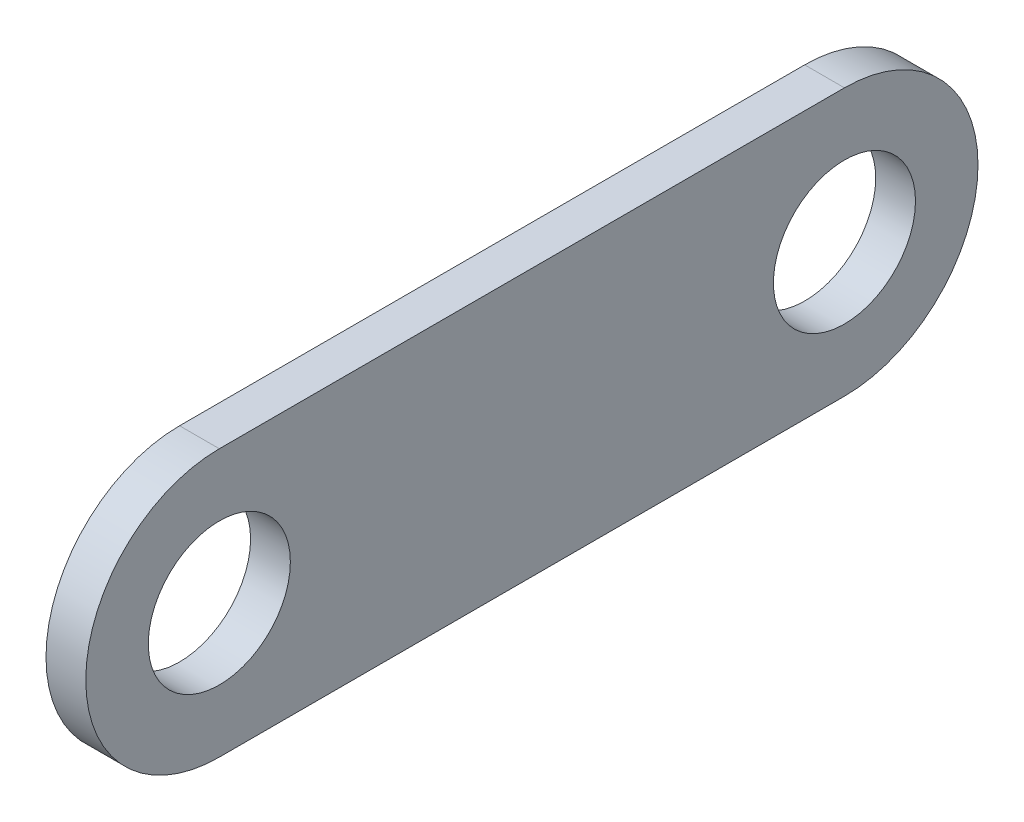
ISO-10303-21;
HEADER;
FILE_DESCRIPTION(('STEP AP214'),'2;1');
FILE_NAME('part.step','',(''),(''),'','','');
FILE_SCHEMA(('AUTOMOTIVE_DESIGN { 1 0 10303 214 1 1 1 1 }'));
ENDSEC;
DATA;
#1=APPLICATION_CONTEXT('core data for automotive mechanical design processes');
#2=APPLICATION_PROTOCOL_DEFINITION('international standard','automotive_design',2000,#1);
#3=PRODUCT_CONTEXT('',#1,'mechanical');
#4=PRODUCT('Part','Part','',(#3));
#5=PRODUCT_RELATED_PRODUCT_CATEGORY('part','',(#4));
#6=PRODUCT_DEFINITION_FORMATION('','',#4);
#7=PRODUCT_DEFINITION_CONTEXT('part definition',#1,'design');
#8=PRODUCT_DEFINITION('design','',#6,#7);
#9=PRODUCT_DEFINITION_SHAPE('','',#8);
#10=(LENGTH_UNIT() NAMED_UNIT(*) SI_UNIT(.MILLI.,.METRE.));
#11=(NAMED_UNIT(*) PLANE_ANGLE_UNIT() SI_UNIT($,.RADIAN.));
#12=(NAMED_UNIT(*) SI_UNIT($,.STERADIAN.) SOLID_ANGLE_UNIT());
#13=UNCERTAINTY_MEASURE_WITH_UNIT(LENGTH_MEASURE(1.E-05),#10,'distance_accuracy_value','');
#14=(GEOMETRIC_REPRESENTATION_CONTEXT(3) GLOBAL_UNCERTAINTY_ASSIGNED_CONTEXT((#13)) GLOBAL_UNIT_ASSIGNED_CONTEXT((#10,
#11,#12)) REPRESENTATION_CONTEXT('',''));
#15=CARTESIAN_POINT('',(0.,0.,0.));
#16=DIRECTION('',(0.,0.,1.));
#17=DIRECTION('',(1.,0.,0.));
#18=AXIS2_PLACEMENT_3D('',#15,#16,#17);
#19=CARTESIAN_POINT('',(0.7112,0.,5.588));
#20=DIRECTION('',(1.,0.,0.));
#21=DIRECTION('',(0.,0.,-1.));
#22=AXIS2_PLACEMENT_3D('',#19,#20,#21);
#23=PLANE('',#22);
#24=CARTESIAN_POINT('',(0.7112,0.,-5.588));
#25=DIRECTION('',(1.,0.,0.));
#26=DIRECTION('',(0.,0.,-1.));
#27=AXIS2_PLACEMENT_3D('',#24,#25,#26);
#28=CIRCLE('',#27,1.27);
#29=CARTESIAN_POINT('',(0.7112,0.,-6.858));
#30=VERTEX_POINT('',#29);
#31=EDGE_CURVE('E101',#30,#30,#28,.T.);
#32=ORIENTED_EDGE('',*,*,#31,.F.);
#33=EDGE_LOOP('',(#32));
#34=FACE_BOUND('',#33,.T.);
#35=CARTESIAN_POINT('',(0.7112,0.,5.588));
#36=DIRECTION('',(1.,0.,0.));
#37=DIRECTION('',(0.,0.,-1.));
#38=AXIS2_PLACEMENT_3D('',#35,#36,#37);
#39=CIRCLE('',#38,2.3876);
#40=CARTESIAN_POINT('',(0.7112,2.3876,5.588));
#41=VERTEX_POINT('',#40);
#42=CARTESIAN_POINT('',(0.7112,-2.3876,5.588));
#43=VERTEX_POINT('',#42);
#44=EDGE_CURVE('E86',#41,#43,#39,.T.);
#45=ORIENTED_EDGE('',*,*,#44,.T.);
#46=DIRECTION('',(0.,0.,-1.));
#47=VECTOR('',#46,1.);
#48=CARTESIAN_POINT('',(0.7112,-2.3876,5.588));
#49=LINE('',#48,#47);
#50=CARTESIAN_POINT('',(0.7112,-2.3876,-5.588));
#51=VERTEX_POINT('',#50);
#52=EDGE_CURVE('E81',#43,#51,#49,.T.);
#53=ORIENTED_EDGE('',*,*,#52,.T.);
#54=CARTESIAN_POINT('',(0.7112,0.,-5.588));
#55=DIRECTION('',(1.,0.,0.));
#56=DIRECTION('',(0.,0.,-1.));
#57=AXIS2_PLACEMENT_3D('',#54,#55,#56);
#58=CIRCLE('',#57,2.3876);
#59=CARTESIAN_POINT('',(0.7112,2.3876,-5.588));
#60=VERTEX_POINT('',#59);
#61=EDGE_CURVE('E84',#51,#60,#58,.T.);
#62=ORIENTED_EDGE('',*,*,#61,.T.);
#63=DIRECTION('',(0.,0.,1.));
#64=VECTOR('',#63,1.);
#65=CARTESIAN_POINT('',(0.7112,2.3876,5.588));
#66=LINE('',#65,#64);
#67=EDGE_CURVE('E51',#60,#41,#66,.T.);
#68=ORIENTED_EDGE('',*,*,#67,.T.);
#69=EDGE_LOOP('',(#45,#53,#62,#68));
#70=FACE_BOUND('',#69,.T.);
#71=CARTESIAN_POINT('',(0.7112,0.,5.588));
#72=DIRECTION('',(1.,0.,0.));
#73=DIRECTION('',(0.,0.,-1.));
#74=AXIS2_PLACEMENT_3D('',#71,#72,#73);
#75=CIRCLE('',#74,1.27);
#76=CARTESIAN_POINT('',(0.7112,0.,4.318));
#77=VERTEX_POINT('',#76);
#78=EDGE_CURVE('E116',#77,#77,#75,.T.);
#79=ORIENTED_EDGE('',*,*,#78,.F.);
#80=EDGE_LOOP('',(#79));
#81=FACE_BOUND('',#80,.T.);
#82=ADVANCED_FACE('F34',(#34,#70,#81),#23,.T.);
#83=CARTESIAN_POINT('',(0.,0.,5.588));
#84=DIRECTION('',(1.,0.,0.));
#85=DIRECTION('',(0.,0.,-1.));
#86=AXIS2_PLACEMENT_3D('',#83,#84,#85);
#87=PLANE('',#86);
#88=CARTESIAN_POINT('',(0.,0.,5.588));
#89=DIRECTION('',(1.,0.,0.));
#90=DIRECTION('',(0.,0.,-1.));
#91=AXIS2_PLACEMENT_3D('',#88,#89,#90);
#92=CIRCLE('',#91,2.3876);
#93=CARTESIAN_POINT('',(0.,2.3876,5.588));
#94=VERTEX_POINT('',#93);
#95=CARTESIAN_POINT('',(0.,-2.3876,5.588));
#96=VERTEX_POINT('',#95);
#97=EDGE_CURVE('E98',#94,#96,#92,.T.);
#98=ORIENTED_EDGE('',*,*,#97,.F.);
#99=DIRECTION('',(0.,0.,1.));
#100=VECTOR('',#99,1.);
#101=CARTESIAN_POINT('',(0.,2.3876,5.588));
#102=LINE('',#101,#100);
#103=CARTESIAN_POINT('',(0.,2.3876,-5.588));
#104=VERTEX_POINT('',#103);
#105=EDGE_CURVE('E74',#104,#94,#102,.T.);
#106=ORIENTED_EDGE('',*,*,#105,.F.);
#107=CARTESIAN_POINT('',(0.,0.,-5.588));
#108=DIRECTION('',(1.,0.,0.));
#109=DIRECTION('',(0.,0.,-1.));
#110=AXIS2_PLACEMENT_3D('',#107,#108,#109);
#111=CIRCLE('',#110,2.3876);
#112=CARTESIAN_POINT('',(0.,-2.3876,-5.588));
#113=VERTEX_POINT('',#112);
#114=EDGE_CURVE('E68',#113,#104,#111,.T.);
#115=ORIENTED_EDGE('',*,*,#114,.F.);
#116=DIRECTION('',(0.,0.,-1.));
#117=VECTOR('',#116,1.);
#118=CARTESIAN_POINT('',(0.,-2.3876,5.588));
#119=LINE('',#118,#117);
#120=EDGE_CURVE('E90',#96,#113,#119,.T.);
#121=ORIENTED_EDGE('',*,*,#120,.F.);
#122=EDGE_LOOP('',(#98,#106,#115,#121));
#123=FACE_BOUND('',#122,.T.);
#124=CARTESIAN_POINT('',(0.,0.,-5.588));
#125=DIRECTION('',(1.,0.,0.));
#126=DIRECTION('',(0.,0.,-1.));
#127=AXIS2_PLACEMENT_3D('',#124,#125,#126);
#128=CIRCLE('',#127,1.27);
#129=CARTESIAN_POINT('',(0.,0.,-6.858));
#130=VERTEX_POINT('',#129);
#131=EDGE_CURVE('E113',#130,#130,#128,.T.);
#132=ORIENTED_EDGE('',*,*,#131,.T.);
#133=EDGE_LOOP('',(#132));
#134=FACE_BOUND('',#133,.T.);
#135=CARTESIAN_POINT('',(0.,0.,5.588));
#136=DIRECTION('',(1.,0.,0.));
#137=DIRECTION('',(0.,0.,-1.));
#138=AXIS2_PLACEMENT_3D('',#135,#136,#137);
#139=CIRCLE('',#138,1.27);
#140=CARTESIAN_POINT('',(0.,0.,4.318));
#141=VERTEX_POINT('',#140);
#142=EDGE_CURVE('E119',#141,#141,#139,.T.);
#143=ORIENTED_EDGE('',*,*,#142,.T.);
#144=EDGE_LOOP('',(#143));
#145=FACE_BOUND('',#144,.T.);
#146=ADVANCED_FACE('F109',(#123,#134,#145),#87,.F.);
#147=CARTESIAN_POINT('',(0.7112,0.,5.588));
#148=DIRECTION('',(-1.,0.,0.));
#149=DIRECTION('',(0.,0.,1.));
#150=AXIS2_PLACEMENT_3D('',#147,#148,#149);
#151=CYLINDRICAL_SURFACE('',#150,2.3876);
#152=ORIENTED_EDGE('',*,*,#97,.T.);
#153=DIRECTION('',(-1.,0.,0.));
#154=VECTOR('',#153,1.);
#155=CARTESIAN_POINT('',(0.7112,-2.3876,5.588));
#156=LINE('',#155,#154);
#157=EDGE_CURVE('E11',#43,#96,#156,.T.);
#158=ORIENTED_EDGE('',*,*,#157,.F.);
#159=ORIENTED_EDGE('',*,*,#44,.F.);
#160=DIRECTION('',(-1.,0.,0.));
#161=VECTOR('',#160,1.);
#162=CARTESIAN_POINT('',(0.7112,2.3876,5.588));
#163=LINE('',#162,#161);
#164=EDGE_CURVE('E94',#41,#94,#163,.T.);
#165=ORIENTED_EDGE('',*,*,#164,.T.);
#166=EDGE_LOOP('',(#152,#158,#159,#165));
#167=FACE_BOUND('',#166,.T.);
#168=ADVANCED_FACE('F36',(#167),#151,.T.);
#169=CARTESIAN_POINT('',(0.7112,-2.3876,5.588));
#170=DIRECTION('',(0.,1.,0.));
#171=DIRECTION('',(0.,0.,1.));
#172=AXIS2_PLACEMENT_3D('',#169,#170,#171);
#173=PLANE('',#172);
#174=ORIENTED_EDGE('',*,*,#120,.T.);
#175=DIRECTION('',(-1.,0.,0.));
#176=VECTOR('',#175,1.);
#177=CARTESIAN_POINT('',(0.7112,-2.3876,-5.588));
#178=LINE('',#177,#176);
#179=EDGE_CURVE('E43',#51,#113,#178,.T.);
#180=ORIENTED_EDGE('',*,*,#179,.F.);
#181=ORIENTED_EDGE('',*,*,#52,.F.);
#182=ORIENTED_EDGE('',*,*,#157,.T.);
#183=EDGE_LOOP('',(#174,#180,#181,#182));
#184=FACE_BOUND('',#183,.T.);
#185=ADVANCED_FACE('F89',(#184),#173,.F.);
#186=CARTESIAN_POINT('',(0.7112,0.,-5.588));
#187=DIRECTION('',(-1.,0.,0.));
#188=DIRECTION('',(0.,0.,1.));
#189=AXIS2_PLACEMENT_3D('',#186,#187,#188);
#190=CYLINDRICAL_SURFACE('',#189,2.3876);
#191=ORIENTED_EDGE('',*,*,#114,.T.);
#192=DIRECTION('',(-1.,0.,0.));
#193=VECTOR('',#192,1.);
#194=CARTESIAN_POINT('',(0.7112,2.3876,-5.588));
#195=LINE('',#194,#193);
#196=EDGE_CURVE('E91',#60,#104,#195,.T.);
#197=ORIENTED_EDGE('',*,*,#196,.F.);
#198=ORIENTED_EDGE('',*,*,#61,.F.);
#199=ORIENTED_EDGE('',*,*,#179,.T.);
#200=EDGE_LOOP('',(#191,#197,#198,#199));
#201=FACE_BOUND('',#200,.T.);
#202=ADVANCED_FACE('F92',(#201),#190,.T.);
#203=CARTESIAN_POINT('',(0.7112,2.3876,5.588));
#204=DIRECTION('',(0.,-1.,0.));
#205=DIRECTION('',(0.,0.,-1.));
#206=AXIS2_PLACEMENT_3D('',#203,#204,#205);
#207=PLANE('',#206);
#208=ORIENTED_EDGE('',*,*,#105,.T.);
#209=ORIENTED_EDGE('',*,*,#164,.F.);
#210=ORIENTED_EDGE('',*,*,#67,.F.);
#211=ORIENTED_EDGE('',*,*,#196,.T.);
#212=EDGE_LOOP('',(#208,#209,#210,#211));
#213=FACE_BOUND('',#212,.T.);
#214=ADVANCED_FACE('F106',(#213),#207,.F.);
#215=CARTESIAN_POINT('',(0.7112,0.,-5.588));
#216=DIRECTION('',(-1.,0.,0.));
#217=DIRECTION('',(0.,0.,1.));
#218=AXIS2_PLACEMENT_3D('',#215,#216,#217);
#219=CYLINDRICAL_SURFACE('',#218,1.27);
#220=ORIENTED_EDGE('',*,*,#31,.T.);
#221=EDGE_LOOP('',(#220));
#222=FACE_BOUND('',#221,.T.);
#223=ORIENTED_EDGE('',*,*,#131,.F.);
#224=EDGE_LOOP('',(#223));
#225=FACE_BOUND('',#224,.T.);
#226=ADVANCED_FACE('F136',(#222,#225),#219,.F.);
#227=CARTESIAN_POINT('',(0.7112,0.,5.588));
#228=DIRECTION('',(-1.,0.,0.));
#229=DIRECTION('',(0.,0.,1.));
#230=AXIS2_PLACEMENT_3D('',#227,#228,#229);
#231=CYLINDRICAL_SURFACE('',#230,1.27);
#232=ORIENTED_EDGE('',*,*,#78,.T.);
#233=EDGE_LOOP('',(#232));
#234=FACE_BOUND('',#233,.T.);
#235=ORIENTED_EDGE('',*,*,#142,.F.);
#236=EDGE_LOOP('',(#235));
#237=FACE_BOUND('',#236,.T.);
#238=ADVANCED_FACE('F125',(#234,#237),#231,.F.);
#239=CLOSED_SHELL('',(#82,#146,#168,#185,#202,#214,#226,#238));
#240=MANIFOLD_SOLID_BREP('B2',#239);
#241=ADVANCED_BREP_SHAPE_REPRESENTATION('',(#18,#240),#14);
#242=SHAPE_DEFINITION_REPRESENTATION(#9,#241);
ENDSEC;
END-ISO-10303-21;
